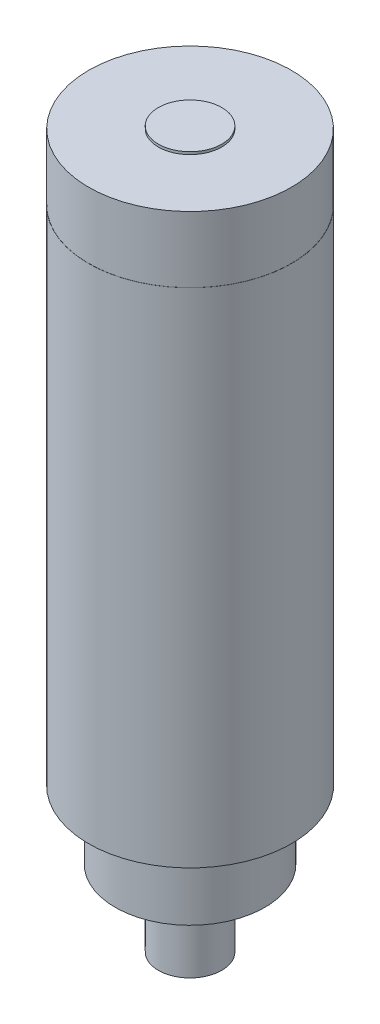
ISO-10303-21;
HEADER;
FILE_DESCRIPTION(('STEP AP214'),'2;1');
FILE_NAME('part.step','',(''),(''),'','','');
FILE_SCHEMA(('AUTOMOTIVE_DESIGN { 1 0 10303 214 1 1 1 1 }'));
ENDSEC;
DATA;
#1=APPLICATION_CONTEXT('core data for automotive mechanical design processes');
#2=APPLICATION_PROTOCOL_DEFINITION('international standard','automotive_design',2000,#1);
#3=PRODUCT_CONTEXT('',#1,'mechanical');
#4=PRODUCT('Part','Part','',(#3));
#5=PRODUCT_RELATED_PRODUCT_CATEGORY('part','',(#4));
#6=PRODUCT_DEFINITION_FORMATION('','',#4);
#7=PRODUCT_DEFINITION_CONTEXT('part definition',#1,'design');
#8=PRODUCT_DEFINITION('design','',#6,#7);
#9=PRODUCT_DEFINITION_SHAPE('','',#8);
#10=(LENGTH_UNIT() NAMED_UNIT(*) SI_UNIT(.MILLI.,.METRE.));
#11=(NAMED_UNIT(*) PLANE_ANGLE_UNIT() SI_UNIT($,.RADIAN.));
#12=(NAMED_UNIT(*) SI_UNIT($,.STERADIAN.) SOLID_ANGLE_UNIT());
#13=UNCERTAINTY_MEASURE_WITH_UNIT(LENGTH_MEASURE(1.E-05),#10,'distance_accuracy_value','');
#14=(GEOMETRIC_REPRESENTATION_CONTEXT(3) GLOBAL_UNCERTAINTY_ASSIGNED_CONTEXT((#13)) GLOBAL_UNIT_ASSIGNED_CONTEXT((#10,
#11,#12)) REPRESENTATION_CONTEXT('',''));
#15=CARTESIAN_POINT('',(0.,0.,0.));
#16=DIRECTION('',(0.,0.,1.));
#17=DIRECTION('',(1.,0.,0.));
#18=AXIS2_PLACEMENT_3D('',#15,#16,#17);
#19=CARTESIAN_POINT('',(0.,0.,0.));
#20=DIRECTION('',(0.,1.,0.));
#21=DIRECTION('',(-1.,0.,0.));
#22=AXIS2_PLACEMENT_3D('',#19,#20,#21);
#23=PLANE('',#22);
#24=CARTESIAN_POINT('',(0.,0.,0.));
#25=DIRECTION('',(0.,1.,0.));
#26=DIRECTION('',(-1.,0.,0.));
#27=AXIS2_PLACEMENT_3D('',#24,#25,#26);
#28=CIRCLE('',#27,12.5);
#29=CARTESIAN_POINT('',(-12.5,0.,0.));
#30=VERTEX_POINT('',#29);
#31=EDGE_CURVE('E10',#30,#30,#28,.T.);
#32=ORIENTED_EDGE('',*,*,#31,.F.);
#33=EDGE_LOOP('',(#32));
#34=FACE_BOUND('',#33,.T.);
#35=ADVANCED_FACE('F30',(#34),#23,.F.);
#36=CARTESIAN_POINT('',(0.,282.,0.));
#37=DIRECTION('',(0.,1.,0.));
#38=DIRECTION('',(-1.,0.,0.));
#39=AXIS2_PLACEMENT_3D('',#36,#37,#38);
#40=CYLINDRICAL_SURFACE('',#39,12.5);
#41=CARTESIAN_POINT('',(0.,30.,0.));
#42=DIRECTION('',(0.,1.,0.));
#43=DIRECTION('',(-1.,0.,0.));
#44=AXIS2_PLACEMENT_3D('',#41,#42,#43);
#45=CIRCLE('',#44,12.5);
#46=CARTESIAN_POINT('',(-12.5,30.,0.));
#47=VERTEX_POINT('',#46);
#48=EDGE_CURVE('E36',#47,#47,#45,.T.);
#49=ORIENTED_EDGE('',*,*,#48,.F.);
#50=EDGE_LOOP('',(#49));
#51=FACE_BOUND('',#50,.T.);
#52=ORIENTED_EDGE('',*,*,#31,.T.);
#53=EDGE_LOOP('',(#52));
#54=FACE_BOUND('',#53,.T.);
#55=ADVANCED_FACE('F114',(#51,#54),#40,.T.);
#56=CARTESIAN_POINT('',(12.5,30.,0.));
#57=DIRECTION('',(0.,1.,0.));
#58=DIRECTION('',(-1.,0.,0.));
#59=AXIS2_PLACEMENT_3D('',#56,#57,#58);
#60=PLANE('',#59);
#61=CARTESIAN_POINT('',(0.,30.,0.));
#62=DIRECTION('',(0.,1.,0.));
#63=DIRECTION('',(-1.,0.,0.));
#64=AXIS2_PLACEMENT_3D('',#61,#62,#63);
#65=CIRCLE('',#64,29.5);
#66=CARTESIAN_POINT('',(-29.5,30.,0.));
#67=VERTEX_POINT('',#66);
#68=EDGE_CURVE('E40',#67,#67,#65,.T.);
#69=ORIENTED_EDGE('',*,*,#68,.F.);
#70=EDGE_LOOP('',(#69));
#71=FACE_BOUND('',#70,.T.);
#72=ORIENTED_EDGE('',*,*,#48,.T.);
#73=EDGE_LOOP('',(#72));
#74=FACE_BOUND('',#73,.T.);
#75=ADVANCED_FACE('F109',(#71,#74),#60,.F.);
#76=CARTESIAN_POINT('',(0.,282.,0.));
#77=DIRECTION('',(0.,1.,0.));
#78=DIRECTION('',(-1.,0.,0.));
#79=AXIS2_PLACEMENT_3D('',#76,#77,#78);
#80=CYLINDRICAL_SURFACE('',#79,29.5);
#81=CARTESIAN_POINT('',(0.,57.,0.));
#82=DIRECTION('',(0.,1.,0.));
#83=DIRECTION('',(-1.,0.,0.));
#84=AXIS2_PLACEMENT_3D('',#81,#82,#83);
#85=CIRCLE('',#84,29.5);
#86=CARTESIAN_POINT('',(-29.5,57.,0.));
#87=VERTEX_POINT('',#86);
#88=EDGE_CURVE('E44',#87,#87,#85,.T.);
#89=ORIENTED_EDGE('',*,*,#88,.F.);
#90=EDGE_LOOP('',(#89));
#91=FACE_BOUND('',#90,.T.);
#92=ORIENTED_EDGE('',*,*,#68,.T.);
#93=EDGE_LOOP('',(#92));
#94=FACE_BOUND('',#93,.T.);
#95=ADVANCED_FACE('F103',(#91,#94),#80,.T.);
#96=CARTESIAN_POINT('',(29.5,57.,0.));
#97=DIRECTION('',(0.,1.,0.));
#98=DIRECTION('',(-1.,0.,0.));
#99=AXIS2_PLACEMENT_3D('',#96,#97,#98);
#100=PLANE('',#99);
#101=CARTESIAN_POINT('',(0.,57.,0.));
#102=DIRECTION('',(0.,1.,0.));
#103=DIRECTION('',(-1.,0.,0.));
#104=AXIS2_PLACEMENT_3D('',#101,#102,#103);
#105=CIRCLE('',#104,40.);
#106=CARTESIAN_POINT('',(-40.,57.,0.));
#107=VERTEX_POINT('',#106);
#108=EDGE_CURVE('E49',#107,#107,#105,.T.);
#109=ORIENTED_EDGE('',*,*,#108,.F.);
#110=EDGE_LOOP('',(#109));
#111=FACE_BOUND('',#110,.T.);
#112=ORIENTED_EDGE('',*,*,#88,.T.);
#113=EDGE_LOOP('',(#112));
#114=FACE_BOUND('',#113,.T.);
#115=ADVANCED_FACE('F97',(#111,#114),#100,.F.);
#116=CARTESIAN_POINT('',(0.,282.,0.));
#117=DIRECTION('',(0.,1.,0.));
#118=DIRECTION('',(-1.,0.,0.));
#119=AXIS2_PLACEMENT_3D('',#116,#117,#118);
#120=CYLINDRICAL_SURFACE('',#119,40.);
#121=CARTESIAN_POINT('',(0.,255.,0.));
#122=DIRECTION('',(0.,1.,0.));
#123=DIRECTION('',(-1.,0.,0.));
#124=AXIS2_PLACEMENT_3D('',#121,#122,#123);
#125=CIRCLE('',#124,40.);
#126=CARTESIAN_POINT('',(-40.,255.,0.));
#127=VERTEX_POINT('',#126);
#128=EDGE_CURVE('E52',#127,#127,#125,.T.);
#129=ORIENTED_EDGE('',*,*,#128,.F.);
#130=EDGE_LOOP('',(#129));
#131=FACE_BOUND('',#130,.T.);
#132=ORIENTED_EDGE('',*,*,#108,.T.);
#133=EDGE_LOOP('',(#132));
#134=FACE_BOUND('',#133,.T.);
#135=ADVANCED_FACE('F91',(#131,#134),#120,.T.);
#136=CARTESIAN_POINT('',(40.,255.,0.));
#137=DIRECTION('',(0.,-1.,0.));
#138=DIRECTION('',(1.,0.,0.));
#139=AXIS2_PLACEMENT_3D('',#136,#137,#138);
#140=PLANE('',#139);
#141=CARTESIAN_POINT('',(0.,255.,0.));
#142=DIRECTION('',(0.,1.,0.));
#143=DIRECTION('',(-1.,0.,0.));
#144=AXIS2_PLACEMENT_3D('',#141,#142,#143);
#145=CIRCLE('',#144,39.95);
#146=CARTESIAN_POINT('',(-39.95,255.,0.));
#147=VERTEX_POINT('',#146);
#148=EDGE_CURVE('E55',#147,#147,#145,.T.);
#149=ORIENTED_EDGE('',*,*,#148,.F.);
#150=EDGE_LOOP('',(#149));
#151=FACE_BOUND('',#150,.T.);
#152=ORIENTED_EDGE('',*,*,#128,.T.);
#153=EDGE_LOOP('',(#152));
#154=FACE_BOUND('',#153,.T.);
#155=ADVANCED_FACE('F85',(#151,#154),#140,.F.);
#156=CARTESIAN_POINT('',(0.,282.,0.));
#157=DIRECTION('',(0.,1.,0.));
#158=DIRECTION('',(-1.,0.,0.));
#159=AXIS2_PLACEMENT_3D('',#156,#157,#158);
#160=CYLINDRICAL_SURFACE('',#159,39.95);
#161=CARTESIAN_POINT('',(0.,281.,0.));
#162=DIRECTION('',(0.,1.,0.));
#163=DIRECTION('',(-1.,0.,0.));
#164=AXIS2_PLACEMENT_3D('',#161,#162,#163);
#165=CIRCLE('',#164,39.95);
#166=CARTESIAN_POINT('',(-39.95,281.,0.));
#167=VERTEX_POINT('',#166);
#168=EDGE_CURVE('E58',#167,#167,#165,.T.);
#169=ORIENTED_EDGE('',*,*,#168,.F.);
#170=EDGE_LOOP('',(#169));
#171=FACE_BOUND('',#170,.T.);
#172=ORIENTED_EDGE('',*,*,#148,.T.);
#173=EDGE_LOOP('',(#172));
#174=FACE_BOUND('',#173,.T.);
#175=ADVANCED_FACE('F79',(#171,#174),#160,.T.);
#176=CARTESIAN_POINT('',(39.95,281.,0.));
#177=DIRECTION('',(0.,-1.,0.));
#178=DIRECTION('',(1.,0.,0.));
#179=AXIS2_PLACEMENT_3D('',#176,#177,#178);
#180=PLANE('',#179);
#181=CARTESIAN_POINT('',(0.,281.,0.));
#182=DIRECTION('',(0.,1.,0.));
#183=DIRECTION('',(-1.,0.,0.));
#184=AXIS2_PLACEMENT_3D('',#181,#182,#183);
#185=CIRCLE('',#184,12.5);
#186=CARTESIAN_POINT('',(-12.5,281.,0.));
#187=VERTEX_POINT('',#186);
#188=EDGE_CURVE('E61',#187,#187,#185,.T.);
#189=ORIENTED_EDGE('',*,*,#188,.F.);
#190=EDGE_LOOP('',(#189));
#191=FACE_BOUND('',#190,.T.);
#192=ORIENTED_EDGE('',*,*,#168,.T.);
#193=EDGE_LOOP('',(#192));
#194=FACE_BOUND('',#193,.T.);
#195=ADVANCED_FACE('F73',(#191,#194),#180,.F.);
#196=CARTESIAN_POINT('',(0.,282.,0.));
#197=DIRECTION('',(0.,1.,0.));
#198=DIRECTION('',(-1.,0.,0.));
#199=AXIS2_PLACEMENT_3D('',#196,#197,#198);
#200=CYLINDRICAL_SURFACE('',#199,12.5);
#201=CARTESIAN_POINT('',(0.,282.,0.));
#202=DIRECTION('',(0.,1.,0.));
#203=DIRECTION('',(-1.,0.,0.));
#204=AXIS2_PLACEMENT_3D('',#201,#202,#203);
#205=CIRCLE('',#204,12.5);
#206=CARTESIAN_POINT('',(-12.5,282.,0.));
#207=VERTEX_POINT('',#206);
#208=EDGE_CURVE('E64',#207,#207,#205,.T.);
#209=ORIENTED_EDGE('',*,*,#208,.F.);
#210=EDGE_LOOP('',(#209));
#211=FACE_BOUND('',#210,.T.);
#212=ORIENTED_EDGE('',*,*,#188,.T.);
#213=EDGE_LOOP('',(#212));
#214=FACE_BOUND('',#213,.T.);
#215=ADVANCED_FACE('F70',(#211,#214),#200,.T.);
#216=CARTESIAN_POINT('',(12.5,282.,0.));
#217=DIRECTION('',(0.,-1.,0.));
#218=DIRECTION('',(1.,0.,0.));
#219=AXIS2_PLACEMENT_3D('',#216,#217,#218);
#220=PLANE('',#219);
#221=ORIENTED_EDGE('',*,*,#208,.T.);
#222=EDGE_LOOP('',(#221));
#223=FACE_BOUND('',#222,.T.);
#224=ADVANCED_FACE('F68',(#223),#220,.F.);
#225=CLOSED_SHELL('',(#35,#55,#75,#95,#115,#135,#155,#175,#195,#215,#224));
#226=MANIFOLD_SOLID_BREP('B2',#225);
#227=ADVANCED_BREP_SHAPE_REPRESENTATION('',(#18,#226),#14);
#228=SHAPE_DEFINITION_REPRESENTATION(#9,#227);
ENDSEC;
END-ISO-10303-21;
